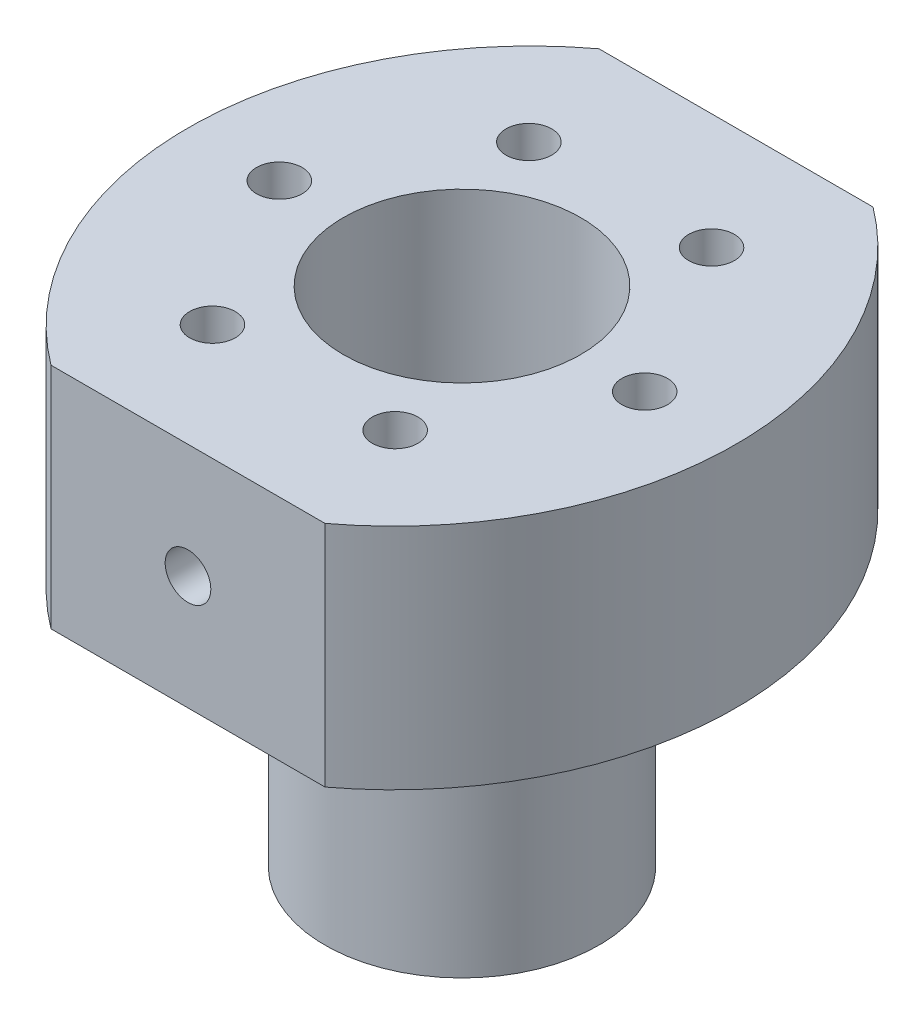
ISO-10303-21;
HEADER;
FILE_DESCRIPTION(('STEP AP214'),'2;1');
FILE_NAME('part.step','',(''),(''),'','','');
FILE_SCHEMA(('AUTOMOTIVE_DESIGN { 1 0 10303 214 1 1 1 1 }'));
ENDSEC;
DATA;
#1=APPLICATION_CONTEXT('core data for automotive mechanical design processes');
#2=APPLICATION_PROTOCOL_DEFINITION('international standard','automotive_design',2000,#1);
#3=PRODUCT_CONTEXT('',#1,'mechanical');
#4=PRODUCT('Part','Part','',(#3));
#5=PRODUCT_RELATED_PRODUCT_CATEGORY('part','',(#4));
#6=PRODUCT_DEFINITION_FORMATION('','',#4);
#7=PRODUCT_DEFINITION_CONTEXT('part definition',#1,'design');
#8=PRODUCT_DEFINITION('design','',#6,#7);
#9=PRODUCT_DEFINITION_SHAPE('','',#8);
#10=(LENGTH_UNIT() NAMED_UNIT(*) SI_UNIT(.MILLI.,.METRE.));
#11=(NAMED_UNIT(*) PLANE_ANGLE_UNIT() SI_UNIT($,.RADIAN.));
#12=(NAMED_UNIT(*) SI_UNIT($,.STERADIAN.) SOLID_ANGLE_UNIT());
#13=UNCERTAINTY_MEASURE_WITH_UNIT(LENGTH_MEASURE(1.E-05),#10,'distance_accuracy_value','');
#14=(GEOMETRIC_REPRESENTATION_CONTEXT(3) GLOBAL_UNCERTAINTY_ASSIGNED_CONTEXT((#13)) GLOBAL_UNIT_ASSIGNED_CONTEXT((#10,
#11,#12)) REPRESENTATION_CONTEXT('',''));
#15=CARTESIAN_POINT('',(0.,0.,0.));
#16=DIRECTION('',(0.,0.,1.));
#17=DIRECTION('',(1.,0.,0.));
#18=AXIS2_PLACEMENT_3D('',#15,#16,#17);
#19=CARTESIAN_POINT('',(7.49999999999937,12.5,0.));
#20=DIRECTION('',(0.,-1.,0.));
#21=DIRECTION('',(0.,0.,-1.));
#22=AXIS2_PLACEMENT_3D('',#19,#20,#21);
#23=CYLINDRICAL_SURFACE('',#22,37.4999999999996);
#24=CARTESIAN_POINT('',(7.49999999999937,-12.5,0.));
#25=DIRECTION('',(0.,1.,0.));
#26=DIRECTION('',(0.,0.,1.));
#27=AXIS2_PLACEMENT_3D('',#24,#25,#26);
#28=CIRCLE('',#27,37.4999999999996);
#29=CARTESIAN_POINT('',(-15.,-12.5,-30.));
#30=VERTEX_POINT('',#29);
#31=CARTESIAN_POINT('',(-15.,-12.5,30.));
#32=VERTEX_POINT('',#31);
#33=EDGE_CURVE('E101',#30,#32,#28,.T.);
#34=ORIENTED_EDGE('',*,*,#33,.T.);
#35=DIRECTION('',(0.,-1.,0.));
#36=VECTOR('',#35,1.);
#37=CARTESIAN_POINT('',(-15.,12.5,30.));
#38=LINE('',#37,#36);
#39=CARTESIAN_POINT('',(-15.,12.5,30.));
#40=VERTEX_POINT('',#39);
#41=EDGE_CURVE('E42',#40,#32,#38,.T.);
#42=ORIENTED_EDGE('',*,*,#41,.F.);
#43=CARTESIAN_POINT('',(7.49999999999937,12.5,0.));
#44=DIRECTION('',(0.,1.,0.));
#45=DIRECTION('',(0.,0.,1.));
#46=AXIS2_PLACEMENT_3D('',#43,#44,#45);
#47=CIRCLE('',#46,37.4999999999996);
#48=CARTESIAN_POINT('',(-15.,12.5,-30.));
#49=VERTEX_POINT('',#48);
#50=EDGE_CURVE('E87',#49,#40,#47,.T.);
#51=ORIENTED_EDGE('',*,*,#50,.F.);
#52=DIRECTION('',(0.,-1.,0.));
#53=VECTOR('',#52,1.);
#54=CARTESIAN_POINT('',(-15.,12.5,-30.));
#55=LINE('',#54,#53);
#56=EDGE_CURVE('E97',#49,#30,#55,.T.);
#57=ORIENTED_EDGE('',*,*,#56,.T.);
#58=EDGE_LOOP('',(#34,#42,#51,#57));
#59=FACE_BOUND('',#58,.T.);
#60=ADVANCED_FACE('F33',(#59),#23,.T.);
#61=CARTESIAN_POINT('',(-15.,12.5,30.));
#62=DIRECTION('',(0.,0.,-1.));
#63=DIRECTION('',(-1.,0.,0.));
#64=AXIS2_PLACEMENT_3D('',#61,#62,#63);
#65=PLANE('',#64);
#66=CARTESIAN_POINT('',(0.,0.,30.));
#67=DIRECTION('',(0.,0.,1.));
#68=DIRECTION('',(1.,0.,0.));
#69=AXIS2_PLACEMENT_3D('',#66,#67,#68);
#70=CIRCLE('',#69,2.5);
#71=CARTESIAN_POINT('',(2.5,0.,30.));
#72=VERTEX_POINT('',#71);
#73=EDGE_CURVE('E127',#72,#72,#70,.T.);
#74=ORIENTED_EDGE('',*,*,#73,.F.);
#75=EDGE_LOOP('',(#74));
#76=FACE_BOUND('',#75,.T.);
#77=DIRECTION('',(1.,0.,0.));
#78=VECTOR('',#77,1.);
#79=CARTESIAN_POINT('',(-15.,-12.5,30.));
#80=LINE('',#79,#78);
#81=CARTESIAN_POINT('',(15.,-12.5,30.));
#82=VERTEX_POINT('',#81);
#83=EDGE_CURVE('E92',#32,#82,#80,.T.);
#84=ORIENTED_EDGE('',*,*,#83,.T.);
#85=DIRECTION('',(0.,-1.,0.));
#86=VECTOR('',#85,1.);
#87=CARTESIAN_POINT('',(15.,12.5,30.));
#88=LINE('',#87,#86);
#89=CARTESIAN_POINT('',(15.,12.5,30.));
#90=VERTEX_POINT('',#89);
#91=EDGE_CURVE('E90',#90,#82,#88,.T.);
#92=ORIENTED_EDGE('',*,*,#91,.F.);
#93=DIRECTION('',(1.,0.,0.));
#94=VECTOR('',#93,1.);
#95=CARTESIAN_POINT('',(-15.,12.5,30.));
#96=LINE('',#95,#94);
#97=EDGE_CURVE('E82',#40,#90,#96,.T.);
#98=ORIENTED_EDGE('',*,*,#97,.F.);
#99=ORIENTED_EDGE('',*,*,#41,.T.);
#100=EDGE_LOOP('',(#84,#92,#98,#99));
#101=FACE_BOUND('',#100,.T.);
#102=ADVANCED_FACE('F91',(#76,#101),#65,.F.);
#103=CARTESIAN_POINT('',(-7.49999999999893,12.5,0.));
#104=DIRECTION('',(0.,-1.,0.));
#105=DIRECTION('',(0.,0.,-1.));
#106=AXIS2_PLACEMENT_3D('',#103,#104,#105);
#107=CYLINDRICAL_SURFACE('',#106,37.4999999999994);
#108=CARTESIAN_POINT('',(-7.49999999999893,-12.5,0.));
#109=DIRECTION('',(0.,1.,0.));
#110=DIRECTION('',(0.,0.,-1.));
#111=AXIS2_PLACEMENT_3D('',#108,#109,#110);
#112=CIRCLE('',#111,37.4999999999994);
#113=CARTESIAN_POINT('',(15.,-12.5,-30.));
#114=VERTEX_POINT('',#113);
#115=EDGE_CURVE('E68',#82,#114,#112,.T.);
#116=ORIENTED_EDGE('',*,*,#115,.T.);
#117=DIRECTION('',(0.,-1.,0.));
#118=VECTOR('',#117,1.);
#119=CARTESIAN_POINT('',(15.,12.5,-30.));
#120=LINE('',#119,#118);
#121=CARTESIAN_POINT('',(15.,12.5,-30.));
#122=VERTEX_POINT('',#121);
#123=EDGE_CURVE('E93',#122,#114,#120,.T.);
#124=ORIENTED_EDGE('',*,*,#123,.F.);
#125=CARTESIAN_POINT('',(-7.49999999999893,12.5,0.));
#126=DIRECTION('',(0.,1.,0.));
#127=DIRECTION('',(0.,0.,-1.));
#128=AXIS2_PLACEMENT_3D('',#125,#126,#127);
#129=CIRCLE('',#128,37.4999999999994);
#130=EDGE_CURVE('E85',#90,#122,#129,.T.);
#131=ORIENTED_EDGE('',*,*,#130,.F.);
#132=ORIENTED_EDGE('',*,*,#91,.T.);
#133=EDGE_LOOP('',(#116,#124,#131,#132));
#134=FACE_BOUND('',#133,.T.);
#135=ADVANCED_FACE('F95',(#134),#107,.T.);
#136=CARTESIAN_POINT('',(-15.,12.5,-30.));
#137=DIRECTION('',(0.,0.,1.));
#138=DIRECTION('',(1.,0.,0.));
#139=AXIS2_PLACEMENT_3D('',#136,#137,#138);
#140=PLANE('',#139);
#141=CARTESIAN_POINT('',(0.,0.,-30.));
#142=DIRECTION('',(0.,0.,1.));
#143=DIRECTION('',(1.,0.,0.));
#144=AXIS2_PLACEMENT_3D('',#141,#142,#143);
#145=CIRCLE('',#144,2.5);
#146=CARTESIAN_POINT('',(2.49999999999999,0.,-30.));
#147=VERTEX_POINT('',#146);
#148=EDGE_CURVE('E36',#147,#147,#145,.T.);
#149=ORIENTED_EDGE('',*,*,#148,.T.);
#150=EDGE_LOOP('',(#149));
#151=FACE_BOUND('',#150,.T.);
#152=DIRECTION('',(-1.,0.,0.));
#153=VECTOR('',#152,1.);
#154=CARTESIAN_POINT('',(-15.,-12.5,-30.));
#155=LINE('',#154,#153);
#156=EDGE_CURVE('E74',#114,#30,#155,.T.);
#157=ORIENTED_EDGE('',*,*,#156,.T.);
#158=ORIENTED_EDGE('',*,*,#56,.F.);
#159=DIRECTION('',(-1.,0.,0.));
#160=VECTOR('',#159,1.);
#161=CARTESIAN_POINT('',(-15.,12.5,-30.));
#162=LINE('',#161,#160);
#163=EDGE_CURVE('E51',#122,#49,#162,.T.);
#164=ORIENTED_EDGE('',*,*,#163,.F.);
#165=ORIENTED_EDGE('',*,*,#123,.T.);
#166=EDGE_LOOP('',(#157,#158,#164,#165));
#167=FACE_BOUND('',#166,.T.);
#168=ADVANCED_FACE('F174',(#151,#167),#140,.F.);
#169=CARTESIAN_POINT('',(7.49999999999937,12.5,0.));
#170=DIRECTION('',(0.,1.,0.));
#171=DIRECTION('',(0.,0.,1.));
#172=AXIS2_PLACEMENT_3D('',#169,#170,#171);
#173=PLANE('',#172);
#174=CARTESIAN_POINT('',(20.,12.5,0.));
#175=DIRECTION('',(0.,1.,0.));
#176=DIRECTION('',(0.,0.,1.));
#177=AXIS2_PLACEMENT_3D('',#174,#175,#176);
#178=CIRCLE('',#177,2.5);
#179=CARTESIAN_POINT('',(20.,12.5,2.5));
#180=VERTEX_POINT('',#179);
#181=EDGE_CURVE('E142',#180,#180,#178,.T.);
#182=ORIENTED_EDGE('',*,*,#181,.F.);
#183=EDGE_LOOP('',(#182));
#184=FACE_BOUND('',#183,.T.);
#185=CARTESIAN_POINT('',(9.99999999999984,12.5,17.3205080756889));
#186=DIRECTION('',(0.,1.,0.));
#187=DIRECTION('',(0.,0.,1.));
#188=AXIS2_PLACEMENT_3D('',#185,#186,#187);
#189=CIRCLE('',#188,2.5);
#190=CARTESIAN_POINT('',(9.99999999999984,12.5,19.8205080756889));
#191=VERTEX_POINT('',#190);
#192=EDGE_CURVE('E148',#191,#191,#189,.T.);
#193=ORIENTED_EDGE('',*,*,#192,.F.);
#194=EDGE_LOOP('',(#193));
#195=FACE_BOUND('',#194,.T.);
#196=CARTESIAN_POINT('',(-10.0000000000002,12.5,17.3205080756887));
#197=DIRECTION('',(0.,1.,0.));
#198=DIRECTION('',(0.,0.,1.));
#199=AXIS2_PLACEMENT_3D('',#196,#197,#198);
#200=CIRCLE('',#199,2.5);
#201=CARTESIAN_POINT('',(-10.0000000000002,12.5,19.8205080756887));
#202=VERTEX_POINT('',#201);
#203=EDGE_CURVE('E154',#202,#202,#200,.T.);
#204=ORIENTED_EDGE('',*,*,#203,.F.);
#205=EDGE_LOOP('',(#204));
#206=FACE_BOUND('',#205,.T.);
#207=CARTESIAN_POINT('',(-20.,12.5,0.));
#208=DIRECTION('',(0.,1.,0.));
#209=DIRECTION('',(0.,0.,1.));
#210=AXIS2_PLACEMENT_3D('',#207,#208,#209);
#211=CIRCLE('',#210,2.5);
#212=CARTESIAN_POINT('',(-20.,12.5,2.5));
#213=VERTEX_POINT('',#212);
#214=EDGE_CURVE('E160',#213,#213,#211,.T.);
#215=ORIENTED_EDGE('',*,*,#214,.F.);
#216=EDGE_LOOP('',(#215));
#217=FACE_BOUND('',#216,.T.);
#218=CARTESIAN_POINT('',(-9.99999999999996,12.5,-17.3205080756888));
#219=DIRECTION('',(0.,1.,0.));
#220=DIRECTION('',(0.,0.,1.));
#221=AXIS2_PLACEMENT_3D('',#218,#219,#220);
#222=CIRCLE('',#221,2.5);
#223=CARTESIAN_POINT('',(-9.99999999999996,12.5,-14.8205080756888));
#224=VERTEX_POINT('',#223);
#225=EDGE_CURVE('E136',#224,#224,#222,.T.);
#226=ORIENTED_EDGE('',*,*,#225,.F.);
#227=EDGE_LOOP('',(#226));
#228=FACE_BOUND('',#227,.T.);
#229=CARTESIAN_POINT('',(10.0000000000001,12.5,-17.3205080756887));
#230=DIRECTION('',(0.,1.,0.));
#231=DIRECTION('',(0.,0.,1.));
#232=AXIS2_PLACEMENT_3D('',#229,#230,#231);
#233=CIRCLE('',#232,2.5);
#234=CARTESIAN_POINT('',(10.0000000000001,12.5,-14.8205080756887));
#235=VERTEX_POINT('',#234);
#236=EDGE_CURVE('E133',#235,#235,#233,.T.);
#237=ORIENTED_EDGE('',*,*,#236,.F.);
#238=EDGE_LOOP('',(#237));
#239=FACE_BOUND('',#238,.T.);
#240=CARTESIAN_POINT('',(0.,12.5,0.));
#241=DIRECTION('',(0.,1.,0.));
#242=DIRECTION('',(0.,0.,1.));
#243=AXIS2_PLACEMENT_3D('',#240,#241,#242);
#244=CIRCLE('',#243,13.);
#245=CARTESIAN_POINT('',(0.,12.5,13.));
#246=VERTEX_POINT('',#245);
#247=EDGE_CURVE('E112',#246,#246,#244,.T.);
#248=ORIENTED_EDGE('',*,*,#247,.F.);
#249=EDGE_LOOP('',(#248));
#250=FACE_BOUND('',#249,.T.);
#251=ORIENTED_EDGE('',*,*,#50,.T.);
#252=ORIENTED_EDGE('',*,*,#97,.T.);
#253=ORIENTED_EDGE('',*,*,#130,.T.);
#254=ORIENTED_EDGE('',*,*,#163,.T.);
#255=EDGE_LOOP('',(#251,#252,#253,#254));
#256=FACE_BOUND('',#255,.T.);
#257=ADVANCED_FACE('F83',(#184,#195,#206,#217,#228,#239,#250,#256),#173,.T.);
#258=CARTESIAN_POINT('',(7.49999999999937,-12.5,0.));
#259=DIRECTION('',(0.,1.,0.));
#260=DIRECTION('',(0.,0.,1.));
#261=AXIS2_PLACEMENT_3D('',#258,#259,#260);
#262=PLANE('',#261);
#263=CARTESIAN_POINT('',(20.,-12.5,0.));
#264=DIRECTION('',(0.,1.,0.));
#265=DIRECTION('',(0.,0.,1.));
#266=AXIS2_PLACEMENT_3D('',#263,#264,#265);
#267=CIRCLE('',#266,2.5);
#268=CARTESIAN_POINT('',(20.,-12.5,2.5));
#269=VERTEX_POINT('',#268);
#270=EDGE_CURVE('E139',#269,#269,#267,.T.);
#271=ORIENTED_EDGE('',*,*,#270,.T.);
#272=EDGE_LOOP('',(#271));
#273=FACE_BOUND('',#272,.T.);
#274=CARTESIAN_POINT('',(9.99999999999984,-12.5,17.3205080756889));
#275=DIRECTION('',(0.,1.,0.));
#276=DIRECTION('',(0.,0.,1.));
#277=AXIS2_PLACEMENT_3D('',#274,#275,#276);
#278=CIRCLE('',#277,2.5);
#279=CARTESIAN_POINT('',(9.99999999999984,-12.5,19.8205080756889));
#280=VERTEX_POINT('',#279);
#281=EDGE_CURVE('E145',#280,#280,#278,.T.);
#282=ORIENTED_EDGE('',*,*,#281,.T.);
#283=EDGE_LOOP('',(#282));
#284=FACE_BOUND('',#283,.T.);
#285=CARTESIAN_POINT('',(-10.0000000000002,-12.5,17.3205080756887));
#286=DIRECTION('',(0.,1.,0.));
#287=DIRECTION('',(0.,0.,1.));
#288=AXIS2_PLACEMENT_3D('',#285,#286,#287);
#289=CIRCLE('',#288,2.5);
#290=CARTESIAN_POINT('',(-10.0000000000002,-12.5,19.8205080756887));
#291=VERTEX_POINT('',#290);
#292=EDGE_CURVE('E151',#291,#291,#289,.T.);
#293=ORIENTED_EDGE('',*,*,#292,.T.);
#294=EDGE_LOOP('',(#293));
#295=FACE_BOUND('',#294,.T.);
#296=CARTESIAN_POINT('',(-20.,-12.5,0.));
#297=DIRECTION('',(0.,1.,0.));
#298=DIRECTION('',(0.,0.,1.));
#299=AXIS2_PLACEMENT_3D('',#296,#297,#298);
#300=CIRCLE('',#299,2.5);
#301=CARTESIAN_POINT('',(-20.,-12.5,2.5));
#302=VERTEX_POINT('',#301);
#303=EDGE_CURVE('E157',#302,#302,#300,.T.);
#304=ORIENTED_EDGE('',*,*,#303,.T.);
#305=EDGE_LOOP('',(#304));
#306=FACE_BOUND('',#305,.T.);
#307=CARTESIAN_POINT('',(-9.99999999999996,-12.5,-17.3205080756888));
#308=DIRECTION('',(0.,1.,0.));
#309=DIRECTION('',(0.,0.,1.));
#310=AXIS2_PLACEMENT_3D('',#307,#308,#309);
#311=CIRCLE('',#310,2.5);
#312=CARTESIAN_POINT('',(-9.99999999999996,-12.5,-14.8205080756888));
#313=VERTEX_POINT('',#312);
#314=EDGE_CURVE('E163',#313,#313,#311,.T.);
#315=ORIENTED_EDGE('',*,*,#314,.T.);
#316=EDGE_LOOP('',(#315));
#317=FACE_BOUND('',#316,.T.);
#318=CARTESIAN_POINT('',(10.0000000000001,-12.5,-17.3205080756887));
#319=DIRECTION('',(0.,1.,0.));
#320=DIRECTION('',(0.,0.,1.));
#321=AXIS2_PLACEMENT_3D('',#318,#319,#320);
#322=CIRCLE('',#321,2.5);
#323=CARTESIAN_POINT('',(10.0000000000001,-12.5,-14.8205080756887));
#324=VERTEX_POINT('',#323);
#325=EDGE_CURVE('E130',#324,#324,#322,.T.);
#326=ORIENTED_EDGE('',*,*,#325,.T.);
#327=EDGE_LOOP('',(#326));
#328=FACE_BOUND('',#327,.T.);
#329=CARTESIAN_POINT('',(0.,-12.5,0.));
#330=DIRECTION('',(0.,-1.,0.));
#331=DIRECTION('',(0.,0.,-1.));
#332=AXIS2_PLACEMENT_3D('',#329,#330,#331);
#333=CIRCLE('',#332,15.);
#334=CARTESIAN_POINT('',(0.,-12.5,-15.));
#335=VERTEX_POINT('',#334);
#336=EDGE_CURVE('E11',#335,#335,#333,.T.);
#337=ORIENTED_EDGE('',*,*,#336,.F.);
#338=EDGE_LOOP('',(#337));
#339=FACE_BOUND('',#338,.T.);
#340=ORIENTED_EDGE('',*,*,#33,.F.);
#341=ORIENTED_EDGE('',*,*,#156,.F.);
#342=ORIENTED_EDGE('',*,*,#115,.F.);
#343=ORIENTED_EDGE('',*,*,#83,.F.);
#344=EDGE_LOOP('',(#340,#341,#342,#343));
#345=FACE_BOUND('',#344,.T.);
#346=ADVANCED_FACE('F173',(#273,#284,#295,#306,#317,#328,#339,#345),#262,.F.);
#347=CARTESIAN_POINT('',(0.,-42.5,0.));
#348=DIRECTION('',(0.,1.,0.));
#349=DIRECTION('',(0.,0.,1.));
#350=AXIS2_PLACEMENT_3D('',#347,#348,#349);
#351=CYLINDRICAL_SURFACE('',#350,15.);
#352=CARTESIAN_POINT('',(0.,-42.5,0.));
#353=DIRECTION('',(0.,-1.,0.));
#354=DIRECTION('',(0.,0.,-1.));
#355=AXIS2_PLACEMENT_3D('',#352,#353,#354);
#356=CIRCLE('',#355,15.);
#357=CARTESIAN_POINT('',(0.,-42.5,-15.));
#358=VERTEX_POINT('',#357);
#359=EDGE_CURVE('E104',#358,#358,#356,.T.);
#360=ORIENTED_EDGE('',*,*,#359,.F.);
#361=EDGE_LOOP('',(#360));
#362=FACE_BOUND('',#361,.T.);
#363=ORIENTED_EDGE('',*,*,#336,.T.);
#364=EDGE_LOOP('',(#363));
#365=FACE_BOUND('',#364,.T.);
#366=ADVANCED_FACE('F206',(#362,#365),#351,.T.);
#367=CARTESIAN_POINT('',(0.,-42.5,0.));
#368=DIRECTION('',(0.,-1.,0.));
#369=DIRECTION('',(0.,0.,-1.));
#370=AXIS2_PLACEMENT_3D('',#367,#368,#369);
#371=PLANE('',#370);
#372=CARTESIAN_POINT('',(0.,-42.5,0.));
#373=DIRECTION('',(0.,-1.,0.));
#374=DIRECTION('',(0.,0.,-1.));
#375=AXIS2_PLACEMENT_3D('',#372,#373,#374);
#376=CIRCLE('',#375,13.);
#377=CARTESIAN_POINT('',(0.,-42.5,-13.));
#378=VERTEX_POINT('',#377);
#379=EDGE_CURVE('E110',#378,#378,#376,.T.);
#380=ORIENTED_EDGE('',*,*,#379,.F.);
#381=EDGE_LOOP('',(#380));
#382=FACE_BOUND('',#381,.T.);
#383=ORIENTED_EDGE('',*,*,#359,.T.);
#384=EDGE_LOOP('',(#383));
#385=FACE_BOUND('',#384,.T.);
#386=ADVANCED_FACE('F212',(#382,#385),#371,.T.);
#387=CARTESIAN_POINT('',(0.,-87.5,0.));
#388=DIRECTION('',(0.,1.,0.));
#389=DIRECTION('',(0.,0.,1.));
#390=AXIS2_PLACEMENT_3D('',#387,#388,#389);
#391=CYLINDRICAL_SURFACE('',#390,13.);
#392=ORIENTED_EDGE('',*,*,#379,.T.);
#393=EDGE_LOOP('',(#392));
#394=FACE_BOUND('',#393,.T.);
#395=ORIENTED_EDGE('',*,*,#247,.T.);
#396=EDGE_LOOP('',(#395));
#397=FACE_BOUND('',#396,.T.);
#398=ADVANCED_FACE('F344',(#394,#397),#391,.F.);
#399=CARTESIAN_POINT('',(0.,0.,-27.5));
#400=DIRECTION('',(0.,0.,-1.));
#401=DIRECTION('',(-1.,0.,0.));
#402=AXIS2_PLACEMENT_3D('',#399,#400,#401);
#403=CYLINDRICAL_SURFACE('',#402,2.5);
#404=CARTESIAN_POINT('',(0.,0.,-27.5));
#405=DIRECTION('',(0.,0.,-1.));
#406=DIRECTION('',(-1.,0.,0.));
#407=AXIS2_PLACEMENT_3D('',#404,#405,#406);
#408=CIRCLE('',#407,2.5);
#409=CARTESIAN_POINT('',(-2.50000000000001,0.,-27.5));
#410=VERTEX_POINT('',#409);
#411=EDGE_CURVE('E122',#410,#410,#408,.T.);
#412=ORIENTED_EDGE('',*,*,#411,.F.);
#413=EDGE_LOOP('',(#412));
#414=FACE_BOUND('',#413,.T.);
#415=ORIENTED_EDGE('',*,*,#148,.F.);
#416=EDGE_LOOP('',(#415));
#417=FACE_BOUND('',#416,.T.);
#418=ADVANCED_FACE('F336',(#414,#417),#403,.F.);
#419=CARTESIAN_POINT('',(0.,0.,-27.5));
#420=DIRECTION('',(0.,0.,-1.));
#421=DIRECTION('',(-1.,0.,0.));
#422=AXIS2_PLACEMENT_3D('',#419,#420,#421);
#423=PLANE('',#422);
#424=ORIENTED_EDGE('',*,*,#411,.T.);
#425=EDGE_LOOP('',(#424));
#426=FACE_BOUND('',#425,.T.);
#427=ADVANCED_FACE('F327',(#426),#423,.T.);
#428=CARTESIAN_POINT('',(0.,0.,25.));
#429=DIRECTION('',(0.,0.,1.));
#430=DIRECTION('',(1.,0.,0.));
#431=AXIS2_PLACEMENT_3D('',#428,#429,#430);
#432=CYLINDRICAL_SURFACE('',#431,2.5);
#433=CARTESIAN_POINT('',(0.,0.,25.));
#434=DIRECTION('',(0.,0.,1.));
#435=DIRECTION('',(1.,0.,0.));
#436=AXIS2_PLACEMENT_3D('',#433,#434,#435);
#437=CIRCLE('',#436,2.5);
#438=CARTESIAN_POINT('',(2.5,0.,25.));
#439=VERTEX_POINT('',#438);
#440=EDGE_CURVE('E126',#439,#439,#437,.T.);
#441=ORIENTED_EDGE('',*,*,#440,.F.);
#442=EDGE_LOOP('',(#441));
#443=FACE_BOUND('',#442,.T.);
#444=ORIENTED_EDGE('',*,*,#73,.T.);
#445=EDGE_LOOP('',(#444));
#446=FACE_BOUND('',#445,.T.);
#447=ADVANCED_FACE('F192',(#443,#446),#432,.F.);
#448=CARTESIAN_POINT('',(0.,0.,25.));
#449=DIRECTION('',(0.,0.,1.));
#450=DIRECTION('',(1.,0.,0.));
#451=AXIS2_PLACEMENT_3D('',#448,#449,#450);
#452=PLANE('',#451);
#453=ORIENTED_EDGE('',*,*,#440,.T.);
#454=EDGE_LOOP('',(#453));
#455=FACE_BOUND('',#454,.T.);
#456=ADVANCED_FACE('F182',(#455),#452,.T.);
#457=CARTESIAN_POINT('',(10.0000000000001,-12.5,-17.3205080756887));
#458=DIRECTION('',(0.,1.,0.));
#459=DIRECTION('',(0.,0.,1.));
#460=AXIS2_PLACEMENT_3D('',#457,#458,#459);
#461=CYLINDRICAL_SURFACE('',#460,2.5);
#462=ORIENTED_EDGE('',*,*,#325,.F.);
#463=EDGE_LOOP('',(#462));
#464=FACE_BOUND('',#463,.T.);
#465=ORIENTED_EDGE('',*,*,#236,.T.);
#466=EDGE_LOOP('',(#465));
#467=FACE_BOUND('',#466,.T.);
#468=ADVANCED_FACE('F180',(#464,#467),#461,.F.);
#469=CARTESIAN_POINT('',(-9.99999999999996,-12.5,-17.3205080756888));
#470=DIRECTION('',(0.,1.,0.));
#471=DIRECTION('',(0.,0.,1.));
#472=AXIS2_PLACEMENT_3D('',#469,#470,#471);
#473=CYLINDRICAL_SURFACE('',#472,2.5);
#474=ORIENTED_EDGE('',*,*,#314,.F.);
#475=EDGE_LOOP('',(#474));
#476=FACE_BOUND('',#475,.T.);
#477=ORIENTED_EDGE('',*,*,#225,.T.);
#478=EDGE_LOOP('',(#477));
#479=FACE_BOUND('',#478,.T.);
#480=ADVANCED_FACE('F169',(#476,#479),#473,.F.);
#481=CARTESIAN_POINT('',(-20.,-12.5,0.));
#482=DIRECTION('',(0.,1.,0.));
#483=DIRECTION('',(0.,0.,1.));
#484=AXIS2_PLACEMENT_3D('',#481,#482,#483);
#485=CYLINDRICAL_SURFACE('',#484,2.5);
#486=ORIENTED_EDGE('',*,*,#303,.F.);
#487=EDGE_LOOP('',(#486));
#488=FACE_BOUND('',#487,.T.);
#489=ORIENTED_EDGE('',*,*,#214,.T.);
#490=EDGE_LOOP('',(#489));
#491=FACE_BOUND('',#490,.T.);
#492=ADVANCED_FACE('F189',(#488,#491),#485,.F.);
#493=CARTESIAN_POINT('',(-10.0000000000002,-12.5,17.3205080756887));
#494=DIRECTION('',(0.,1.,0.));
#495=DIRECTION('',(0.,0.,1.));
#496=AXIS2_PLACEMENT_3D('',#493,#494,#495);
#497=CYLINDRICAL_SURFACE('',#496,2.5);
#498=ORIENTED_EDGE('',*,*,#292,.F.);
#499=EDGE_LOOP('',(#498));
#500=FACE_BOUND('',#499,.T.);
#501=ORIENTED_EDGE('',*,*,#203,.T.);
#502=EDGE_LOOP('',(#501));
#503=FACE_BOUND('',#502,.T.);
#504=ADVANCED_FACE('F264',(#500,#503),#497,.F.);
#505=CARTESIAN_POINT('',(9.99999999999984,-12.5,17.3205080756889));
#506=DIRECTION('',(0.,1.,0.));
#507=DIRECTION('',(0.,0.,1.));
#508=AXIS2_PLACEMENT_3D('',#505,#506,#507);
#509=CYLINDRICAL_SURFACE('',#508,2.5);
#510=ORIENTED_EDGE('',*,*,#281,.F.);
#511=EDGE_LOOP('',(#510));
#512=FACE_BOUND('',#511,.T.);
#513=ORIENTED_EDGE('',*,*,#192,.T.);
#514=EDGE_LOOP('',(#513));
#515=FACE_BOUND('',#514,.T.);
#516=ADVANCED_FACE('F274',(#512,#515),#509,.F.);
#517=CARTESIAN_POINT('',(20.,-12.5,0.));
#518=DIRECTION('',(0.,1.,0.));
#519=DIRECTION('',(0.,0.,1.));
#520=AXIS2_PLACEMENT_3D('',#517,#518,#519);
#521=CYLINDRICAL_SURFACE('',#520,2.5);
#522=ORIENTED_EDGE('',*,*,#270,.F.);
#523=EDGE_LOOP('',(#522));
#524=FACE_BOUND('',#523,.T.);
#525=ORIENTED_EDGE('',*,*,#181,.T.);
#526=EDGE_LOOP('',(#525));
#527=FACE_BOUND('',#526,.T.);
#528=ADVANCED_FACE('F284',(#524,#527),#521,.F.);
#529=CLOSED_SHELL('',(#60,#102,#135,#168,#257,#346,#366,#386,#398,#418,#427,#447,#456,#468,#480,
#492,#504,#516,#528));
#530=MANIFOLD_SOLID_BREP('B2',#529);
#531=ADVANCED_BREP_SHAPE_REPRESENTATION('',(#18,#530),#14);
#532=SHAPE_DEFINITION_REPRESENTATION(#9,#531);
ENDSEC;
END-ISO-10303-21;
